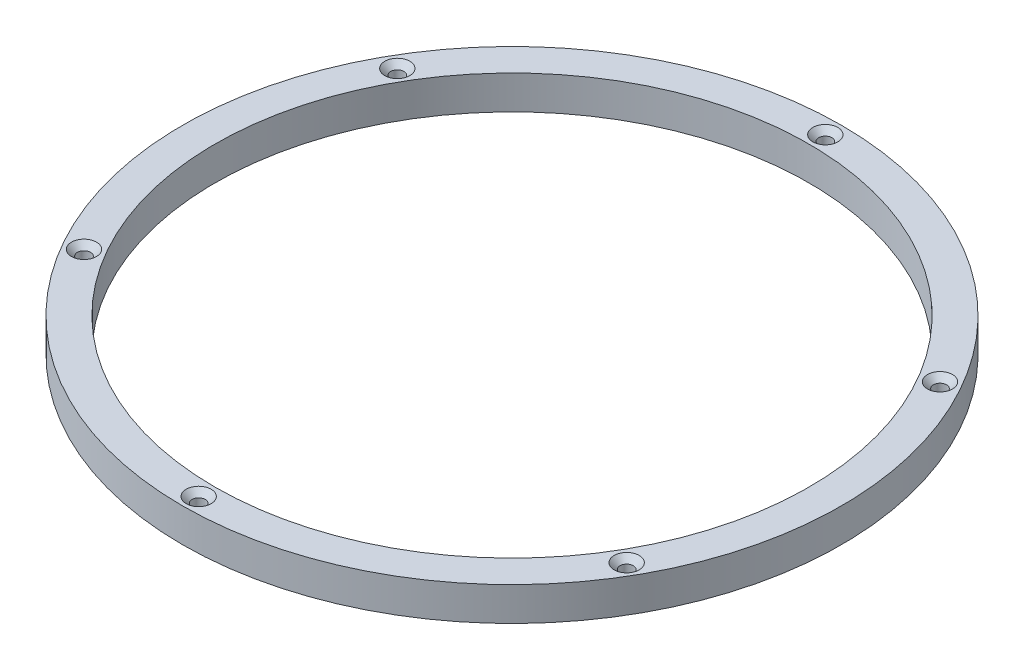
ISO-10303-21;
HEADER;
FILE_DESCRIPTION(('STEP AP214'),'2;1');
FILE_NAME('part.step','',(''),(''),'','','');
FILE_SCHEMA(('AUTOMOTIVE_DESIGN { 1 0 10303 214 1 1 1 1 }'));
ENDSEC;
DATA;
#1=APPLICATION_CONTEXT('core data for automotive mechanical design processes');
#2=APPLICATION_PROTOCOL_DEFINITION('international standard','automotive_design',2000,#1);
#3=PRODUCT_CONTEXT('',#1,'mechanical');
#4=PRODUCT('Part','Part','',(#3));
#5=PRODUCT_RELATED_PRODUCT_CATEGORY('part','',(#4));
#6=PRODUCT_DEFINITION_FORMATION('','',#4);
#7=PRODUCT_DEFINITION_CONTEXT('part definition',#1,'design');
#8=PRODUCT_DEFINITION('design','',#6,#7);
#9=PRODUCT_DEFINITION_SHAPE('','',#8);
#10=(LENGTH_UNIT() NAMED_UNIT(*) SI_UNIT(.MILLI.,.METRE.));
#11=(NAMED_UNIT(*) PLANE_ANGLE_UNIT() SI_UNIT($,.RADIAN.));
#12=(NAMED_UNIT(*) SI_UNIT($,.STERADIAN.) SOLID_ANGLE_UNIT());
#13=UNCERTAINTY_MEASURE_WITH_UNIT(LENGTH_MEASURE(1.E-05),#10,'distance_accuracy_value','');
#14=(GEOMETRIC_REPRESENTATION_CONTEXT(3) GLOBAL_UNCERTAINTY_ASSIGNED_CONTEXT((#13)) GLOBAL_UNIT_ASSIGNED_CONTEXT((#10,
#11,#12)) REPRESENTATION_CONTEXT('',''));
#15=CARTESIAN_POINT('',(0.,0.,0.));
#16=DIRECTION('',(0.,0.,1.));
#17=DIRECTION('',(1.,0.,0.));
#18=AXIS2_PLACEMENT_3D('',#15,#16,#17);
#19=CARTESIAN_POINT('',(0.,14.,0.));
#20=DIRECTION('',(0.,-1.,0.));
#21=DIRECTION('',(0.,0.,-1.));
#22=AXIS2_PLACEMENT_3D('',#19,#20,#21);
#23=CYLINDRICAL_SURFACE('',#22,123.5);
#24=CARTESIAN_POINT('',(0.,14.,0.));
#25=DIRECTION('',(0.,1.,0.));
#26=DIRECTION('',(0.,0.,1.));
#27=AXIS2_PLACEMENT_3D('',#24,#25,#26);
#28=CIRCLE('',#27,123.5);
#29=CARTESIAN_POINT('',(0.,14.,123.5));
#30=VERTEX_POINT('',#29);
#31=EDGE_CURVE('E42',#30,#30,#28,.T.);
#32=ORIENTED_EDGE('',*,*,#31,.T.);
#33=EDGE_LOOP('',(#32));
#34=FACE_BOUND('',#33,.T.);
#35=CARTESIAN_POINT('',(0.,0.,0.));
#36=DIRECTION('',(0.,1.,0.));
#37=DIRECTION('',(0.,0.,1.));
#38=AXIS2_PLACEMENT_3D('',#35,#36,#37);
#39=CIRCLE('',#38,123.5);
#40=CARTESIAN_POINT('',(0.,0.,123.5));
#41=VERTEX_POINT('',#40);
#42=EDGE_CURVE('E49',#41,#41,#39,.T.);
#43=ORIENTED_EDGE('',*,*,#42,.F.);
#44=EDGE_LOOP('',(#43));
#45=FACE_BOUND('',#44,.T.);
#46=ADVANCED_FACE('F35',(#34,#45),#23,.F.);
#47=CARTESIAN_POINT('',(0.,14.,0.));
#48=DIRECTION('',(0.,-1.,0.));
#49=DIRECTION('',(0.,0.,-1.));
#50=AXIS2_PLACEMENT_3D('',#47,#48,#49);
#51=CYLINDRICAL_SURFACE('',#50,137.);
#52=CARTESIAN_POINT('',(0.,14.,0.));
#53=DIRECTION('',(0.,1.,0.));
#54=DIRECTION('',(0.,0.,1.));
#55=AXIS2_PLACEMENT_3D('',#52,#53,#54);
#56=CIRCLE('',#55,137.);
#57=CARTESIAN_POINT('',(0.,14.,137.));
#58=VERTEX_POINT('',#57);
#59=EDGE_CURVE('E10',#58,#58,#56,.T.);
#60=ORIENTED_EDGE('',*,*,#59,.F.);
#61=EDGE_LOOP('',(#60));
#62=FACE_BOUND('',#61,.T.);
#63=CARTESIAN_POINT('',(0.,0.,0.));
#64=DIRECTION('',(0.,1.,0.));
#65=DIRECTION('',(0.,0.,1.));
#66=AXIS2_PLACEMENT_3D('',#63,#64,#65);
#67=CIRCLE('',#66,137.);
#68=CARTESIAN_POINT('',(0.,0.,137.));
#69=VERTEX_POINT('',#68);
#70=EDGE_CURVE('E38',#69,#69,#67,.T.);
#71=ORIENTED_EDGE('',*,*,#70,.T.);
#72=EDGE_LOOP('',(#71));
#73=FACE_BOUND('',#72,.T.);
#74=ADVANCED_FACE('F117',(#62,#73),#51,.T.);
#75=CARTESIAN_POINT('',(0.,14.,0.));
#76=DIRECTION('',(0.,1.,0.));
#77=DIRECTION('',(0.,0.,1.));
#78=AXIS2_PLACEMENT_3D('',#75,#76,#77);
#79=PLANE('',#78);
#80=CARTESIAN_POINT('',(112.799808842922,14.,-65.1250000000013));
#81=DIRECTION('',(0.,1.,0.));
#82=DIRECTION('',(0.,0.,1.));
#83=AXIS2_PLACEMENT_3D('',#80,#81,#82);
#84=CIRCLE('',#83,5.2);
#85=CARTESIAN_POINT('',(112.799808842922,14.,-59.9250000000013));
#86=VERTEX_POINT('',#85);
#87=EDGE_CURVE('E107',#86,#86,#84,.T.);
#88=ORIENTED_EDGE('',*,*,#87,.F.);
#89=EDGE_LOOP('',(#88));
#90=FACE_BOUND('',#89,.T.);
#91=CARTESIAN_POINT('',(112.799808842924,14.,65.1249999999989));
#92=DIRECTION('',(0.,1.,0.));
#93=DIRECTION('',(0.,0.,1.));
#94=AXIS2_PLACEMENT_3D('',#91,#92,#93);
#95=CIRCLE('',#94,5.2);
#96=CARTESIAN_POINT('',(112.799808842924,14.,70.3249999999989));
#97=VERTEX_POINT('',#96);
#98=EDGE_CURVE('E98',#97,#97,#95,.T.);
#99=ORIENTED_EDGE('',*,*,#98,.F.);
#100=EDGE_LOOP('',(#99));
#101=FACE_BOUND('',#100,.T.);
#102=CARTESIAN_POINT('',(0.,14.,130.25));
#103=DIRECTION('',(0.,1.,0.));
#104=DIRECTION('',(0.,0.,1.));
#105=AXIS2_PLACEMENT_3D('',#102,#103,#104);
#106=CIRCLE('',#105,5.2);
#107=CARTESIAN_POINT('',(0.,14.,135.45));
#108=VERTEX_POINT('',#107);
#109=EDGE_CURVE('E89',#108,#108,#106,.T.);
#110=ORIENTED_EDGE('',*,*,#109,.F.);
#111=EDGE_LOOP('',(#110));
#112=FACE_BOUND('',#111,.T.);
#113=CARTESIAN_POINT('',(-112.799808842923,14.,65.1250000000005));
#114=DIRECTION('',(0.,1.,0.));
#115=DIRECTION('',(0.,0.,1.));
#116=AXIS2_PLACEMENT_3D('',#113,#114,#115);
#117=CIRCLE('',#116,5.2);
#118=CARTESIAN_POINT('',(-112.799808842923,14.,70.3250000000005));
#119=VERTEX_POINT('',#118);
#120=EDGE_CURVE('E80',#119,#119,#117,.T.);
#121=ORIENTED_EDGE('',*,*,#120,.F.);
#122=EDGE_LOOP('',(#121));
#123=FACE_BOUND('',#122,.T.);
#124=CARTESIAN_POINT('',(-112.799808842923,14.,-65.1249999999997));
#125=DIRECTION('',(0.,1.,0.));
#126=DIRECTION('',(0.,0.,1.));
#127=AXIS2_PLACEMENT_3D('',#124,#125,#126);
#128=CIRCLE('',#127,5.2);
#129=CARTESIAN_POINT('',(-112.799808842923,14.,-59.9249999999997));
#130=VERTEX_POINT('',#129);
#131=EDGE_CURVE('E71',#130,#130,#128,.T.);
#132=ORIENTED_EDGE('',*,*,#131,.F.);
#133=EDGE_LOOP('',(#132));
#134=FACE_BOUND('',#133,.T.);
#135=CARTESIAN_POINT('',(0.,14.,-130.25));
#136=DIRECTION('',(0.,1.,0.));
#137=DIRECTION('',(0.,0.,1.));
#138=AXIS2_PLACEMENT_3D('',#135,#136,#137);
#139=CIRCLE('',#138,5.2);
#140=CARTESIAN_POINT('',(0.,14.,-125.05));
#141=VERTEX_POINT('',#140);
#142=EDGE_CURVE('E60',#141,#141,#139,.T.);
#143=ORIENTED_EDGE('',*,*,#142,.F.);
#144=EDGE_LOOP('',(#143));
#145=FACE_BOUND('',#144,.T.);
#146=ORIENTED_EDGE('',*,*,#31,.F.);
#147=EDGE_LOOP('',(#146));
#148=FACE_BOUND('',#147,.T.);
#149=ORIENTED_EDGE('',*,*,#59,.T.);
#150=EDGE_LOOP('',(#149));
#151=FACE_BOUND('',#150,.T.);
#152=ADVANCED_FACE('F113',(#90,#101,#112,#123,#134,#145,#148,#151),#79,.T.);
#153=CARTESIAN_POINT('',(0.,0.,0.));
#154=DIRECTION('',(0.,1.,0.));
#155=DIRECTION('',(0.,0.,1.));
#156=AXIS2_PLACEMENT_3D('',#153,#154,#155);
#157=PLANE('',#156);
#158=CARTESIAN_POINT('',(112.799808842922,0.,-65.1250000000013));
#159=DIRECTION('',(0.,1.,0.));
#160=DIRECTION('',(0.,0.,1.));
#161=AXIS2_PLACEMENT_3D('',#158,#159,#160);
#162=CIRCLE('',#161,2.74999999999997);
#163=CARTESIAN_POINT('',(112.799808842922,0.,-62.3750000000013));
#164=VERTEX_POINT('',#163);
#165=EDGE_CURVE('E101',#164,#164,#162,.T.);
#166=ORIENTED_EDGE('',*,*,#165,.T.);
#167=EDGE_LOOP('',(#166));
#168=FACE_BOUND('',#167,.T.);
#169=CARTESIAN_POINT('',(112.799808842924,0.,65.1249999999989));
#170=DIRECTION('',(0.,1.,0.));
#171=DIRECTION('',(0.,0.,1.));
#172=AXIS2_PLACEMENT_3D('',#169,#170,#171);
#173=CIRCLE('',#172,2.74999999999997);
#174=CARTESIAN_POINT('',(112.799808842924,0.,67.8749999999989));
#175=VERTEX_POINT('',#174);
#176=EDGE_CURVE('E92',#175,#175,#173,.T.);
#177=ORIENTED_EDGE('',*,*,#176,.T.);
#178=EDGE_LOOP('',(#177));
#179=FACE_BOUND('',#178,.T.);
#180=CARTESIAN_POINT('',(0.,0.,130.25));
#181=DIRECTION('',(0.,1.,0.));
#182=DIRECTION('',(0.,0.,1.));
#183=AXIS2_PLACEMENT_3D('',#180,#181,#182);
#184=CIRCLE('',#183,2.74999999999998);
#185=CARTESIAN_POINT('',(0.,0.,133.));
#186=VERTEX_POINT('',#185);
#187=EDGE_CURVE('E83',#186,#186,#184,.T.);
#188=ORIENTED_EDGE('',*,*,#187,.T.);
#189=EDGE_LOOP('',(#188));
#190=FACE_BOUND('',#189,.T.);
#191=CARTESIAN_POINT('',(-112.799808842923,0.,65.1250000000005));
#192=DIRECTION('',(0.,1.,0.));
#193=DIRECTION('',(0.,0.,1.));
#194=AXIS2_PLACEMENT_3D('',#191,#192,#193);
#195=CIRCLE('',#194,2.74999999999997);
#196=CARTESIAN_POINT('',(-112.799808842923,0.,67.8750000000005));
#197=VERTEX_POINT('',#196);
#198=EDGE_CURVE('E74',#197,#197,#195,.T.);
#199=ORIENTED_EDGE('',*,*,#198,.T.);
#200=EDGE_LOOP('',(#199));
#201=FACE_BOUND('',#200,.T.);
#202=CARTESIAN_POINT('',(-112.799808842923,0.,-65.1249999999997));
#203=DIRECTION('',(0.,1.,0.));
#204=DIRECTION('',(0.,0.,1.));
#205=AXIS2_PLACEMENT_3D('',#202,#203,#204);
#206=CIRCLE('',#205,2.74999999999997);
#207=CARTESIAN_POINT('',(-112.799808842923,0.,-62.3749999999998));
#208=VERTEX_POINT('',#207);
#209=EDGE_CURVE('E65',#208,#208,#206,.T.);
#210=ORIENTED_EDGE('',*,*,#209,.T.);
#211=EDGE_LOOP('',(#210));
#212=FACE_BOUND('',#211,.T.);
#213=CARTESIAN_POINT('',(0.,0.,-130.25));
#214=DIRECTION('',(0.,1.,0.));
#215=DIRECTION('',(0.,0.,1.));
#216=AXIS2_PLACEMENT_3D('',#213,#214,#215);
#217=CIRCLE('',#216,2.74999999999998);
#218=CARTESIAN_POINT('',(0.,0.,-127.5));
#219=VERTEX_POINT('',#218);
#220=EDGE_CURVE('E51',#219,#219,#217,.T.);
#221=ORIENTED_EDGE('',*,*,#220,.T.);
#222=EDGE_LOOP('',(#221));
#223=FACE_BOUND('',#222,.T.);
#224=ORIENTED_EDGE('',*,*,#42,.T.);
#225=EDGE_LOOP('',(#224));
#226=FACE_BOUND('',#225,.T.);
#227=ORIENTED_EDGE('',*,*,#70,.F.);
#228=EDGE_LOOP('',(#227));
#229=FACE_BOUND('',#228,.T.);
#230=ADVANCED_FACE('F116',(#168,#179,#190,#201,#212,#223,#226,#229),#157,.F.);
#231=CARTESIAN_POINT('',(0.,14.,-130.25));
#232=DIRECTION('',(0.,1.,0.));
#233=DIRECTION('',(0.,0.,1.));
#234=AXIS2_PLACEMENT_3D('',#231,#232,#233);
#235=CYLINDRICAL_SURFACE('',#234,2.74999999999998);
#236=ORIENTED_EDGE('',*,*,#220,.F.);
#237=EDGE_LOOP('',(#236));
#238=FACE_BOUND('',#237,.T.);
#239=CARTESIAN_POINT('',(0.,11.55,-130.25));
#240=DIRECTION('',(0.,1.,0.));
#241=DIRECTION('',(0.,0.,1.));
#242=AXIS2_PLACEMENT_3D('',#239,#240,#241);
#243=CIRCLE('',#242,2.74999999999999);
#244=CARTESIAN_POINT('',(0.,11.55,-127.5));
#245=VERTEX_POINT('',#244);
#246=EDGE_CURVE('E56',#245,#245,#243,.T.);
#247=ORIENTED_EDGE('',*,*,#246,.T.);
#248=EDGE_LOOP('',(#247));
#249=FACE_BOUND('',#248,.T.);
#250=ADVANCED_FACE('F142',(#238,#249),#235,.F.);
#251=CARTESIAN_POINT('',(0.,14.,-130.25));
#252=DIRECTION('',(0.,1.,0.));
#253=DIRECTION('',(0.,0.,1.));
#254=AXIS2_PLACEMENT_3D('',#251,#252,#253);
#255=CONICAL_SURFACE('',#254,5.2,0.785398163397449);
#256=ORIENTED_EDGE('',*,*,#246,.F.);
#257=EDGE_LOOP('',(#256));
#258=FACE_BOUND('',#257,.T.);
#259=ORIENTED_EDGE('',*,*,#142,.T.);
#260=EDGE_LOOP('',(#259));
#261=FACE_BOUND('',#260,.T.);
#262=ADVANCED_FACE('F147',(#258,#261),#255,.F.);
#263=CARTESIAN_POINT('',(-112.799808842923,14.,-65.1249999999997));
#264=DIRECTION('',(0.,1.,0.));
#265=DIRECTION('',(0.,0.,1.));
#266=AXIS2_PLACEMENT_3D('',#263,#264,#265);
#267=CYLINDRICAL_SURFACE('',#266,2.74999999999998);
#268=ORIENTED_EDGE('',*,*,#209,.F.);
#269=EDGE_LOOP('',(#268));
#270=FACE_BOUND('',#269,.T.);
#271=CARTESIAN_POINT('',(-112.799808842923,11.55,-65.1249999999997));
#272=DIRECTION('',(0.,1.,0.));
#273=DIRECTION('',(0.,0.,1.));
#274=AXIS2_PLACEMENT_3D('',#271,#272,#273);
#275=CIRCLE('',#274,2.74999999999999);
#276=CARTESIAN_POINT('',(-112.799808842923,11.55,-62.3749999999998));
#277=VERTEX_POINT('',#276);
#278=EDGE_CURVE('E68',#277,#277,#275,.T.);
#279=ORIENTED_EDGE('',*,*,#278,.T.);
#280=EDGE_LOOP('',(#279));
#281=FACE_BOUND('',#280,.T.);
#282=ADVANCED_FACE('F151',(#270,#281),#267,.F.);
#283=CARTESIAN_POINT('',(-112.799808842923,14.,-65.1249999999997));
#284=DIRECTION('',(0.,1.,0.));
#285=DIRECTION('',(0.,0.,1.));
#286=AXIS2_PLACEMENT_3D('',#283,#284,#285);
#287=CONICAL_SURFACE('',#286,5.2,0.785398163397448);
#288=ORIENTED_EDGE('',*,*,#278,.F.);
#289=EDGE_LOOP('',(#288));
#290=FACE_BOUND('',#289,.T.);
#291=ORIENTED_EDGE('',*,*,#131,.T.);
#292=EDGE_LOOP('',(#291));
#293=FACE_BOUND('',#292,.T.);
#294=ADVANCED_FACE('F155',(#290,#293),#287,.F.);
#295=CARTESIAN_POINT('',(-112.799808842923,14.,65.1250000000005));
#296=DIRECTION('',(0.,1.,0.));
#297=DIRECTION('',(0.,0.,1.));
#298=AXIS2_PLACEMENT_3D('',#295,#296,#297);
#299=CYLINDRICAL_SURFACE('',#298,2.74999999999998);
#300=ORIENTED_EDGE('',*,*,#198,.F.);
#301=EDGE_LOOP('',(#300));
#302=FACE_BOUND('',#301,.T.);
#303=CARTESIAN_POINT('',(-112.799808842923,11.55,65.1250000000005));
#304=DIRECTION('',(0.,1.,0.));
#305=DIRECTION('',(0.,0.,1.));
#306=AXIS2_PLACEMENT_3D('',#303,#304,#305);
#307=CIRCLE('',#306,2.74999999999999);
#308=CARTESIAN_POINT('',(-112.799808842923,11.55,67.8750000000005));
#309=VERTEX_POINT('',#308);
#310=EDGE_CURVE('E77',#309,#309,#307,.T.);
#311=ORIENTED_EDGE('',*,*,#310,.T.);
#312=EDGE_LOOP('',(#311));
#313=FACE_BOUND('',#312,.T.);
#314=ADVANCED_FACE('F159',(#302,#313),#299,.F.);
#315=CARTESIAN_POINT('',(-112.799808842923,14.,65.1250000000005));
#316=DIRECTION('',(0.,1.,0.));
#317=DIRECTION('',(0.,0.,1.));
#318=AXIS2_PLACEMENT_3D('',#315,#316,#317);
#319=CONICAL_SURFACE('',#318,5.2,0.785398163397448);
#320=ORIENTED_EDGE('',*,*,#310,.F.);
#321=EDGE_LOOP('',(#320));
#322=FACE_BOUND('',#321,.T.);
#323=ORIENTED_EDGE('',*,*,#120,.T.);
#324=EDGE_LOOP('',(#323));
#325=FACE_BOUND('',#324,.T.);
#326=ADVANCED_FACE('F163',(#322,#325),#319,.F.);
#327=CARTESIAN_POINT('',(0.,14.,130.25));
#328=DIRECTION('',(0.,1.,0.));
#329=DIRECTION('',(0.,0.,1.));
#330=AXIS2_PLACEMENT_3D('',#327,#328,#329);
#331=CYLINDRICAL_SURFACE('',#330,2.74999999999998);
#332=ORIENTED_EDGE('',*,*,#187,.F.);
#333=EDGE_LOOP('',(#332));
#334=FACE_BOUND('',#333,.T.);
#335=CARTESIAN_POINT('',(0.,11.55,130.25));
#336=DIRECTION('',(0.,1.,0.));
#337=DIRECTION('',(0.,0.,1.));
#338=AXIS2_PLACEMENT_3D('',#335,#336,#337);
#339=CIRCLE('',#338,2.74999999999999);
#340=CARTESIAN_POINT('',(0.,11.55,133.));
#341=VERTEX_POINT('',#340);
#342=EDGE_CURVE('E86',#341,#341,#339,.T.);
#343=ORIENTED_EDGE('',*,*,#342,.T.);
#344=EDGE_LOOP('',(#343));
#345=FACE_BOUND('',#344,.T.);
#346=ADVANCED_FACE('F167',(#334,#345),#331,.F.);
#347=CARTESIAN_POINT('',(0.,14.,130.25));
#348=DIRECTION('',(0.,1.,0.));
#349=DIRECTION('',(0.,0.,1.));
#350=AXIS2_PLACEMENT_3D('',#347,#348,#349);
#351=CONICAL_SURFACE('',#350,5.2,0.785398163397449);
#352=ORIENTED_EDGE('',*,*,#342,.F.);
#353=EDGE_LOOP('',(#352));
#354=FACE_BOUND('',#353,.T.);
#355=ORIENTED_EDGE('',*,*,#109,.T.);
#356=EDGE_LOOP('',(#355));
#357=FACE_BOUND('',#356,.T.);
#358=ADVANCED_FACE('F171',(#354,#357),#351,.F.);
#359=CARTESIAN_POINT('',(112.799808842924,14.,65.1249999999989));
#360=DIRECTION('',(0.,1.,0.));
#361=DIRECTION('',(0.,0.,1.));
#362=AXIS2_PLACEMENT_3D('',#359,#360,#361);
#363=CYLINDRICAL_SURFACE('',#362,2.74999999999998);
#364=ORIENTED_EDGE('',*,*,#176,.F.);
#365=EDGE_LOOP('',(#364));
#366=FACE_BOUND('',#365,.T.);
#367=CARTESIAN_POINT('',(112.799808842924,11.55,65.1249999999989));
#368=DIRECTION('',(0.,1.,0.));
#369=DIRECTION('',(0.,0.,1.));
#370=AXIS2_PLACEMENT_3D('',#367,#368,#369);
#371=CIRCLE('',#370,2.74999999999999);
#372=CARTESIAN_POINT('',(112.799808842924,11.55,67.8749999999989));
#373=VERTEX_POINT('',#372);
#374=EDGE_CURVE('E95',#373,#373,#371,.T.);
#375=ORIENTED_EDGE('',*,*,#374,.T.);
#376=EDGE_LOOP('',(#375));
#377=FACE_BOUND('',#376,.T.);
#378=ADVANCED_FACE('F175',(#366,#377),#363,.F.);
#379=CARTESIAN_POINT('',(112.799808842924,14.,65.1249999999989));
#380=DIRECTION('',(0.,1.,0.));
#381=DIRECTION('',(0.,0.,1.));
#382=AXIS2_PLACEMENT_3D('',#379,#380,#381);
#383=CONICAL_SURFACE('',#382,5.2,0.785398163397448);
#384=ORIENTED_EDGE('',*,*,#374,.F.);
#385=EDGE_LOOP('',(#384));
#386=FACE_BOUND('',#385,.T.);
#387=ORIENTED_EDGE('',*,*,#98,.T.);
#388=EDGE_LOOP('',(#387));
#389=FACE_BOUND('',#388,.T.);
#390=ADVANCED_FACE('F179',(#386,#389),#383,.F.);
#391=CARTESIAN_POINT('',(112.799808842922,14.,-65.1250000000013));
#392=DIRECTION('',(0.,1.,0.));
#393=DIRECTION('',(0.,0.,1.));
#394=AXIS2_PLACEMENT_3D('',#391,#392,#393);
#395=CYLINDRICAL_SURFACE('',#394,2.74999999999998);
#396=ORIENTED_EDGE('',*,*,#165,.F.);
#397=EDGE_LOOP('',(#396));
#398=FACE_BOUND('',#397,.T.);
#399=CARTESIAN_POINT('',(112.799808842922,11.55,-65.1250000000013));
#400=DIRECTION('',(0.,1.,0.));
#401=DIRECTION('',(0.,0.,1.));
#402=AXIS2_PLACEMENT_3D('',#399,#400,#401);
#403=CIRCLE('',#402,2.74999999999999);
#404=CARTESIAN_POINT('',(112.799808842922,11.55,-62.3750000000013));
#405=VERTEX_POINT('',#404);
#406=EDGE_CURVE('E104',#405,#405,#403,.T.);
#407=ORIENTED_EDGE('',*,*,#406,.T.);
#408=EDGE_LOOP('',(#407));
#409=FACE_BOUND('',#408,.T.);
#410=ADVANCED_FACE('F183',(#398,#409),#395,.F.);
#411=CARTESIAN_POINT('',(112.799808842922,14.,-65.1250000000013));
#412=DIRECTION('',(0.,1.,0.));
#413=DIRECTION('',(0.,0.,1.));
#414=AXIS2_PLACEMENT_3D('',#411,#412,#413);
#415=CONICAL_SURFACE('',#414,5.2,0.785398163397448);
#416=ORIENTED_EDGE('',*,*,#406,.F.);
#417=EDGE_LOOP('',(#416));
#418=FACE_BOUND('',#417,.T.);
#419=ORIENTED_EDGE('',*,*,#87,.T.);
#420=EDGE_LOOP('',(#419));
#421=FACE_BOUND('',#420,.T.);
#422=ADVANCED_FACE('F111',(#418,#421),#415,.F.);
#423=CLOSED_SHELL('',(#46,#74,#152,#230,#250,#262,#282,#294,#314,#326,#346,#358,#378,#390,#410,#422));
#424=MANIFOLD_SOLID_BREP('B2',#423);
#425=ADVANCED_BREP_SHAPE_REPRESENTATION('',(#18,#424),#14);
#426=SHAPE_DEFINITION_REPRESENTATION(#9,#425);
ENDSEC;
END-ISO-10303-21;
